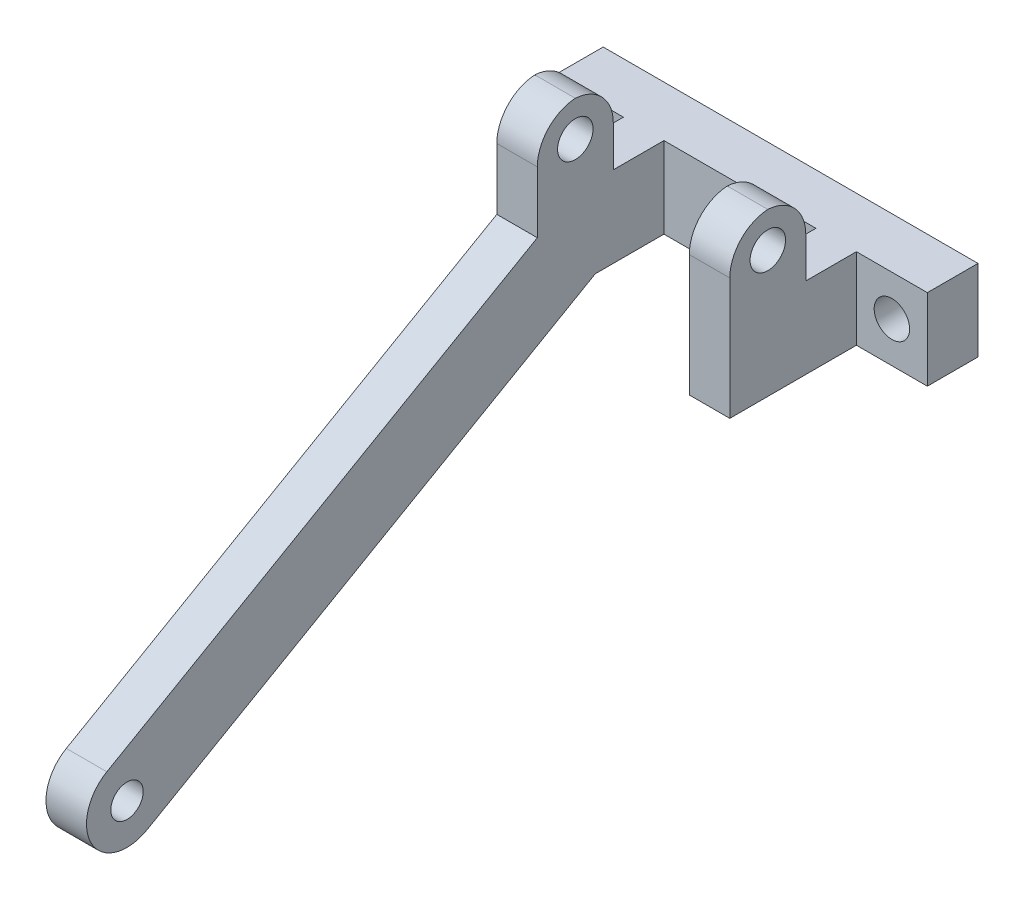
ISO-10303-21;
HEADER;
FILE_DESCRIPTION(('STEP AP214'),'2;1');
FILE_NAME('part.step','',(''),(''),'','','');
FILE_SCHEMA(('AUTOMOTIVE_DESIGN { 1 0 10303 214 1 1 1 1 }'));
ENDSEC;
DATA;
#1=APPLICATION_CONTEXT('core data for automotive mechanical design processes');
#2=APPLICATION_PROTOCOL_DEFINITION('international standard','automotive_design',2000,#1);
#3=PRODUCT_CONTEXT('',#1,'mechanical');
#4=PRODUCT('Part','Part','',(#3));
#5=PRODUCT_RELATED_PRODUCT_CATEGORY('part','',(#4));
#6=PRODUCT_DEFINITION_FORMATION('','',#4);
#7=PRODUCT_DEFINITION_CONTEXT('part definition',#1,'design');
#8=PRODUCT_DEFINITION('design','',#6,#7);
#9=PRODUCT_DEFINITION_SHAPE('','',#8);
#10=(LENGTH_UNIT() NAMED_UNIT(*) SI_UNIT(.MILLI.,.METRE.));
#11=(NAMED_UNIT(*) PLANE_ANGLE_UNIT() SI_UNIT($,.RADIAN.));
#12=(NAMED_UNIT(*) SI_UNIT($,.STERADIAN.) SOLID_ANGLE_UNIT());
#13=UNCERTAINTY_MEASURE_WITH_UNIT(LENGTH_MEASURE(1.E-05),#10,'distance_accuracy_value','');
#14=(GEOMETRIC_REPRESENTATION_CONTEXT(3) GLOBAL_UNCERTAINTY_ASSIGNED_CONTEXT((#13)) GLOBAL_UNIT_ASSIGNED_CONTEXT((#10,
#11,#12)) REPRESENTATION_CONTEXT('',''));
#15=CARTESIAN_POINT('',(0.,0.,0.));
#16=DIRECTION('',(0.,0.,1.));
#17=DIRECTION('',(1.,0.,0.));
#18=AXIS2_PLACEMENT_3D('',#15,#16,#17);
#19=CARTESIAN_POINT('',(-18.5,4.00000000000001,5.));
#20=DIRECTION('',(0.,-1.,0.));
#21=DIRECTION('',(1.,0.,0.));
#22=AXIS2_PLACEMENT_3D('',#19,#20,#21);
#23=PLANE('',#22);
#24=DIRECTION('',(-1.,0.,0.));
#25=VECTOR('',#24,1.);
#26=CARTESIAN_POINT('',(11.5,4.,9.99999999999999));
#27=LINE('',#26,#25);
#28=CARTESIAN_POINT('',(11.5,4.,9.99999999999999));
#29=VERTEX_POINT('',#28);
#30=CARTESIAN_POINT('',(7.50000000000001,4.,9.99999999999999));
#31=VERTEX_POINT('',#30);
#32=EDGE_CURVE('E239',#29,#31,#27,.T.);
#33=ORIENTED_EDGE('',*,*,#32,.F.);
#34=DIRECTION('',(0.,0.,-1.));
#35=VECTOR('',#34,1.);
#36=CARTESIAN_POINT('',(11.5,4.,17.5));
#37=LINE('',#36,#35);
#38=CARTESIAN_POINT('',(11.5,3.99999999999999,5.));
#39=VERTEX_POINT('',#38);
#40=EDGE_CURVE('E405',#29,#39,#37,.T.);
#41=ORIENTED_EDGE('',*,*,#40,.T.);
#42=DIRECTION('',(-1.,0.,0.));
#43=VECTOR('',#42,1.);
#44=CARTESIAN_POINT('',(-18.5,4.00000000000001,5.));
#45=LINE('',#44,#43);
#46=CARTESIAN_POINT('',(18.5,3.99999999999999,5.));
#47=VERTEX_POINT('',#46);
#48=EDGE_CURVE('E313',#47,#39,#45,.T.);
#49=ORIENTED_EDGE('',*,*,#48,.F.);
#50=DIRECTION('',(0.,0.,-1.));
#51=VECTOR('',#50,1.);
#52=CARTESIAN_POINT('',(18.5,3.99999999999999,5.));
#53=LINE('',#52,#51);
#54=CARTESIAN_POINT('',(18.5,3.99999999999999,0.));
#55=VERTEX_POINT('',#54);
#56=EDGE_CURVE('E269',#47,#55,#53,.T.);
#57=ORIENTED_EDGE('',*,*,#56,.T.);
#58=DIRECTION('',(-1.,0.,0.));
#59=VECTOR('',#58,1.);
#60=CARTESIAN_POINT('',(-18.5,4.00000000000001,0.));
#61=LINE('',#60,#59);
#62=CARTESIAN_POINT('',(-18.5,4.00000000000001,0.));
#63=VERTEX_POINT('',#62);
#64=EDGE_CURVE('E346',#55,#63,#61,.T.);
#65=ORIENTED_EDGE('',*,*,#64,.T.);
#66=DIRECTION('',(0.,0.,-1.));
#67=VECTOR('',#66,1.);
#68=CARTESIAN_POINT('',(-18.5,4.00000000000001,5.));
#69=LINE('',#68,#67);
#70=CARTESIAN_POINT('',(-18.5,4.00000000000001,5.));
#71=VERTEX_POINT('',#70);
#72=EDGE_CURVE('E332',#71,#63,#69,.T.);
#73=ORIENTED_EDGE('',*,*,#72,.F.);
#74=CARTESIAN_POINT('',(-11.5,4.,5.));
#75=VERTEX_POINT('',#74);
#76=EDGE_CURVE('E314',#75,#71,#45,.T.);
#77=ORIENTED_EDGE('',*,*,#76,.F.);
#78=DIRECTION('',(0.,0.,-1.));
#79=VECTOR('',#78,1.);
#80=CARTESIAN_POINT('',(-11.5,4.,17.5));
#81=LINE('',#80,#79);
#82=CARTESIAN_POINT('',(-11.5,4.,10.));
#83=VERTEX_POINT('',#82);
#84=EDGE_CURVE('E298',#83,#75,#81,.T.);
#85=ORIENTED_EDGE('',*,*,#84,.F.);
#86=DIRECTION('',(-1.,0.,0.));
#87=VECTOR('',#86,1.);
#88=CARTESIAN_POINT('',(-11.5,4.,10.));
#89=LINE('',#88,#87);
#90=CARTESIAN_POINT('',(-7.5,4.,10.));
#91=VERTEX_POINT('',#90);
#92=EDGE_CURVE('E246',#91,#83,#89,.T.);
#93=ORIENTED_EDGE('',*,*,#92,.F.);
#94=DIRECTION('',(0.,0.,-1.));
#95=VECTOR('',#94,1.);
#96=CARTESIAN_POINT('',(-7.5,4.,17.5));
#97=LINE('',#96,#95);
#98=CARTESIAN_POINT('',(-7.5,4.,5.));
#99=VERTEX_POINT('',#98);
#100=EDGE_CURVE('E256',#91,#99,#97,.T.);
#101=ORIENTED_EDGE('',*,*,#100,.T.);
#102=CARTESIAN_POINT('',(7.5,3.99999999999999,5.));
#103=VERTEX_POINT('',#102);
#104=EDGE_CURVE('E309',#103,#99,#45,.T.);
#105=ORIENTED_EDGE('',*,*,#104,.F.);
#106=DIRECTION('',(0.,0.,-1.));
#107=VECTOR('',#106,1.);
#108=CARTESIAN_POINT('',(7.5,4.,17.5));
#109=LINE('',#108,#107);
#110=EDGE_CURVE('E408',#31,#103,#109,.T.);
#111=ORIENTED_EDGE('',*,*,#110,.F.);
#112=EDGE_LOOP('',(#33,#41,#49,#57,#65,#73,#77,#85,#93,#101,#105,#111));
#113=FACE_BOUND('',#112,.T.);
#114=ADVANCED_FACE('F37',(#113),#23,.F.);
#115=CARTESIAN_POINT('',(0.,0.,5.));
#116=DIRECTION('',(0.,0.,1.));
#117=DIRECTION('',(1.,0.,0.));
#118=AXIS2_PLACEMENT_3D('',#115,#116,#117);
#119=PLANE('',#118);
#120=CARTESIAN_POINT('',(15.,0.,5.));
#121=DIRECTION('',(0.,0.,1.));
#122=DIRECTION('',(-1.,0.,0.));
#123=AXIS2_PLACEMENT_3D('',#120,#121,#122);
#124=CIRCLE('',#123,1.75);
#125=CARTESIAN_POINT('',(13.25,0.,5.));
#126=VERTEX_POINT('',#125);
#127=EDGE_CURVE('E350',#126,#126,#124,.T.);
#128=ORIENTED_EDGE('',*,*,#127,.F.);
#129=EDGE_LOOP('',(#128));
#130=FACE_BOUND('',#129,.T.);
#131=ORIENTED_EDGE('',*,*,#48,.T.);
#132=DIRECTION('',(0.,1.,0.));
#133=VECTOR('',#132,1.);
#134=CARTESIAN_POINT('',(11.5,4.,5.));
#135=LINE('',#134,#133);
#136=CARTESIAN_POINT('',(11.5,-4.,5.));
#137=VERTEX_POINT('',#136);
#138=EDGE_CURVE('E273',#137,#39,#135,.T.);
#139=ORIENTED_EDGE('',*,*,#138,.F.);
#140=DIRECTION('',(1.,0.,0.));
#141=VECTOR('',#140,1.);
#142=CARTESIAN_POINT('',(-18.5,-4.00000000000001,5.));
#143=LINE('',#142,#141);
#144=CARTESIAN_POINT('',(18.5,-4.00000000000001,5.));
#145=VERTEX_POINT('',#144);
#146=EDGE_CURVE('E315',#137,#145,#143,.T.);
#147=ORIENTED_EDGE('',*,*,#146,.T.);
#148=DIRECTION('',(0.,1.,0.));
#149=VECTOR('',#148,1.);
#150=CARTESIAN_POINT('',(18.5,3.99999999999999,5.));
#151=LINE('',#150,#149);
#152=EDGE_CURVE('E320',#145,#47,#151,.T.);
#153=ORIENTED_EDGE('',*,*,#152,.T.);
#154=EDGE_LOOP('',(#131,#139,#147,#153));
#155=FACE_BOUND('',#154,.T.);
#156=ADVANCED_FACE('F446',(#130,#155),#119,.T.);
#157=CARTESIAN_POINT('',(-7.5,-4.00000000000001,5.));
#158=VERTEX_POINT('',#157);
#159=CARTESIAN_POINT('',(7.5,-4.00000000000001,5.));
#160=VERTEX_POINT('',#159);
#161=EDGE_CURVE('E354',#158,#160,#143,.T.);
#162=ORIENTED_EDGE('',*,*,#161,.T.);
#163=DIRECTION('',(0.,-1.,0.));
#164=VECTOR('',#163,1.);
#165=CARTESIAN_POINT('',(7.5,4.,5.));
#166=LINE('',#165,#164);
#167=EDGE_CURVE('E421',#103,#160,#166,.T.);
#168=ORIENTED_EDGE('',*,*,#167,.F.);
#169=ORIENTED_EDGE('',*,*,#104,.T.);
#170=DIRECTION('',(0.,1.,0.));
#171=VECTOR('',#170,1.);
#172=CARTESIAN_POINT('',(-7.5,4.,5.));
#173=LINE('',#172,#171);
#174=EDGE_CURVE('E403',#158,#99,#173,.T.);
#175=ORIENTED_EDGE('',*,*,#174,.F.);
#176=EDGE_LOOP('',(#162,#168,#169,#175));
#177=FACE_BOUND('',#176,.T.);
#178=ADVANCED_FACE('F476',(#177),#119,.T.);
#179=DIRECTION('',(0.,-1.,0.));
#180=VECTOR('',#179,1.);
#181=CARTESIAN_POINT('',(-11.5,4.,5.));
#182=LINE('',#181,#180);
#183=CARTESIAN_POINT('',(-11.5,-4.,5.));
#184=VERTEX_POINT('',#183);
#185=EDGE_CURVE('E302',#75,#184,#182,.T.);
#186=ORIENTED_EDGE('',*,*,#185,.F.);
#187=ORIENTED_EDGE('',*,*,#76,.T.);
#188=DIRECTION('',(0.,-1.,0.));
#189=VECTOR('',#188,1.);
#190=CARTESIAN_POINT('',(-18.5,4.00000000000001,5.));
#191=LINE('',#190,#189);
#192=CARTESIAN_POINT('',(-18.5,-4.00000000000001,5.));
#193=VERTEX_POINT('',#192);
#194=EDGE_CURVE('E322',#71,#193,#191,.T.);
#195=ORIENTED_EDGE('',*,*,#194,.T.);
#196=EDGE_CURVE('E341',#193,#184,#143,.T.);
#197=ORIENTED_EDGE('',*,*,#196,.T.);
#198=EDGE_LOOP('',(#186,#187,#195,#197));
#199=FACE_BOUND('',#198,.T.);
#200=CARTESIAN_POINT('',(-15.,0.,5.));
#201=DIRECTION('',(0.,0.,1.));
#202=DIRECTION('',(1.,0.,0.));
#203=AXIS2_PLACEMENT_3D('',#200,#201,#202);
#204=CIRCLE('',#203,1.75);
#205=CARTESIAN_POINT('',(-13.25,0.,5.));
#206=VERTEX_POINT('',#205);
#207=EDGE_CURVE('E465',#206,#206,#204,.T.);
#208=ORIENTED_EDGE('',*,*,#207,.F.);
#209=EDGE_LOOP('',(#208));
#210=FACE_BOUND('',#209,.T.);
#211=ADVANCED_FACE('F370',(#199,#210),#119,.T.);
#212=CARTESIAN_POINT('',(0.,0.,0.));
#213=DIRECTION('',(0.,0.,1.));
#214=DIRECTION('',(1.,0.,0.));
#215=AXIS2_PLACEMENT_3D('',#212,#213,#214);
#216=PLANE('',#215);
#217=DIRECTION('',(0.,1.,0.));
#218=VECTOR('',#217,1.);
#219=CARTESIAN_POINT('',(18.5,3.99999999999999,0.));
#220=LINE('',#219,#218);
#221=CARTESIAN_POINT('',(18.5,-4.00000000000001,0.));
#222=VERTEX_POINT('',#221);
#223=EDGE_CURVE('E348',#222,#55,#220,.T.);
#224=ORIENTED_EDGE('',*,*,#223,.F.);
#225=DIRECTION('',(1.,0.,0.));
#226=VECTOR('',#225,1.);
#227=CARTESIAN_POINT('',(-18.5,-4.00000000000001,0.));
#228=LINE('',#227,#226);
#229=CARTESIAN_POINT('',(-18.5,-4.00000000000001,0.));
#230=VERTEX_POINT('',#229);
#231=EDGE_CURVE('E342',#230,#222,#228,.T.);
#232=ORIENTED_EDGE('',*,*,#231,.F.);
#233=DIRECTION('',(0.,-1.,0.));
#234=VECTOR('',#233,1.);
#235=CARTESIAN_POINT('',(-18.5,4.00000000000001,0.));
#236=LINE('',#235,#234);
#237=EDGE_CURVE('E344',#63,#230,#236,.T.);
#238=ORIENTED_EDGE('',*,*,#237,.F.);
#239=ORIENTED_EDGE('',*,*,#64,.F.);
#240=EDGE_LOOP('',(#224,#232,#238,#239));
#241=FACE_BOUND('',#240,.T.);
#242=CARTESIAN_POINT('',(15.,0.,0.));
#243=DIRECTION('',(0.,0.,1.));
#244=DIRECTION('',(-1.,0.,0.));
#245=AXIS2_PLACEMENT_3D('',#242,#243,#244);
#246=CIRCLE('',#245,1.75);
#247=CARTESIAN_POINT('',(13.25,0.,0.));
#248=VERTEX_POINT('',#247);
#249=EDGE_CURVE('E460',#248,#248,#246,.T.);
#250=ORIENTED_EDGE('',*,*,#249,.T.);
#251=EDGE_LOOP('',(#250));
#252=FACE_BOUND('',#251,.T.);
#253=CARTESIAN_POINT('',(-15.,0.,0.));
#254=DIRECTION('',(0.,0.,1.));
#255=DIRECTION('',(1.,0.,0.));
#256=AXIS2_PLACEMENT_3D('',#253,#254,#255);
#257=CIRCLE('',#256,1.75);
#258=CARTESIAN_POINT('',(-13.25,0.,0.));
#259=VERTEX_POINT('',#258);
#260=EDGE_CURVE('E463',#259,#259,#257,.T.);
#261=ORIENTED_EDGE('',*,*,#260,.T.);
#262=EDGE_LOOP('',(#261));
#263=FACE_BOUND('',#262,.T.);
#264=ADVANCED_FACE('F453',(#241,#252,#263),#216,.F.);
#265=CARTESIAN_POINT('',(18.5,3.99999999999999,5.));
#266=DIRECTION('',(-1.,0.,0.));
#267=DIRECTION('',(0.,-1.,0.));
#268=AXIS2_PLACEMENT_3D('',#265,#266,#267);
#269=PLANE('',#268);
#270=ORIENTED_EDGE('',*,*,#223,.T.);
#271=ORIENTED_EDGE('',*,*,#56,.F.);
#272=ORIENTED_EDGE('',*,*,#152,.F.);
#273=DIRECTION('',(0.,0.,-1.));
#274=VECTOR('',#273,1.);
#275=CARTESIAN_POINT('',(18.5,-4.00000000000001,5.));
#276=LINE('',#275,#274);
#277=EDGE_CURVE('E338',#145,#222,#276,.T.);
#278=ORIENTED_EDGE('',*,*,#277,.T.);
#279=EDGE_LOOP('',(#270,#271,#272,#278));
#280=FACE_BOUND('',#279,.T.);
#281=ADVANCED_FACE('F451',(#280),#269,.F.);
#282=CARTESIAN_POINT('',(-18.5,4.00000000000001,5.));
#283=DIRECTION('',(1.,0.,0.));
#284=DIRECTION('',(0.,1.,0.));
#285=AXIS2_PLACEMENT_3D('',#282,#283,#284);
#286=PLANE('',#285);
#287=ORIENTED_EDGE('',*,*,#237,.T.);
#288=DIRECTION('',(0.,0.,-1.));
#289=VECTOR('',#288,1.);
#290=CARTESIAN_POINT('',(-18.5,-4.00000000000001,5.));
#291=LINE('',#290,#289);
#292=EDGE_CURVE('E335',#193,#230,#291,.T.);
#293=ORIENTED_EDGE('',*,*,#292,.F.);
#294=ORIENTED_EDGE('',*,*,#194,.F.);
#295=ORIENTED_EDGE('',*,*,#72,.T.);
#296=EDGE_LOOP('',(#287,#293,#294,#295));
#297=FACE_BOUND('',#296,.T.);
#298=ADVANCED_FACE('F375',(#297),#286,.F.);
#299=CARTESIAN_POINT('',(-18.5,-4.00000000000001,5.));
#300=DIRECTION('',(0.,1.,0.));
#301=DIRECTION('',(0.,0.,1.));
#302=AXIS2_PLACEMENT_3D('',#299,#300,#301);
#303=PLANE('',#302);
#304=DIRECTION('',(0.,0.,-1.));
#305=VECTOR('',#304,1.);
#306=CARTESIAN_POINT('',(-7.5,-4.,17.5));
#307=LINE('',#306,#305);
#308=CARTESIAN_POINT('',(-7.5,-4.,11.7824011968437));
#309=VERTEX_POINT('',#308);
#310=EDGE_CURVE('E41',#309,#158,#307,.T.);
#311=ORIENTED_EDGE('',*,*,#310,.F.);
#312=DIRECTION('',(-1.,0.,0.));
#313=VECTOR('',#312,1.);
#314=CARTESIAN_POINT('',(51.9820828305763,-3.99999999999999,11.7824011968437));
#315=LINE('',#314,#313);
#316=CARTESIAN_POINT('',(-11.5,-4.,11.7824011968437));
#317=VERTEX_POINT('',#316);
#318=EDGE_CURVE('E59',#309,#317,#315,.T.);
#319=ORIENTED_EDGE('',*,*,#318,.T.);
#320=DIRECTION('',(0.,0.,-1.));
#321=VECTOR('',#320,1.);
#322=CARTESIAN_POINT('',(-11.5,-4.,17.5));
#323=LINE('',#322,#321);
#324=EDGE_CURVE('E296',#317,#184,#323,.T.);
#325=ORIENTED_EDGE('',*,*,#324,.T.);
#326=ORIENTED_EDGE('',*,*,#196,.F.);
#327=ORIENTED_EDGE('',*,*,#292,.T.);
#328=ORIENTED_EDGE('',*,*,#231,.T.);
#329=ORIENTED_EDGE('',*,*,#277,.F.);
#330=ORIENTED_EDGE('',*,*,#146,.F.);
#331=DIRECTION('',(0.,0.,-1.));
#332=VECTOR('',#331,1.);
#333=CARTESIAN_POINT('',(11.5,-4.,17.5));
#334=LINE('',#333,#332);
#335=CARTESIAN_POINT('',(11.5,-4.,17.5));
#336=VERTEX_POINT('',#335);
#337=EDGE_CURVE('E417',#336,#137,#334,.T.);
#338=ORIENTED_EDGE('',*,*,#337,.F.);
#339=DIRECTION('',(1.,0.,0.));
#340=VECTOR('',#339,1.);
#341=CARTESIAN_POINT('',(11.5,-4.,17.5));
#342=LINE('',#341,#340);
#343=CARTESIAN_POINT('',(7.5,-4.,17.5));
#344=VERTEX_POINT('',#343);
#345=EDGE_CURVE('E420',#344,#336,#342,.T.);
#346=ORIENTED_EDGE('',*,*,#345,.F.);
#347=DIRECTION('',(0.,0.,-1.));
#348=VECTOR('',#347,1.);
#349=CARTESIAN_POINT('',(7.5,-4.,17.5));
#350=LINE('',#349,#348);
#351=EDGE_CURVE('E412',#344,#160,#350,.T.);
#352=ORIENTED_EDGE('',*,*,#351,.T.);
#353=ORIENTED_EDGE('',*,*,#161,.F.);
#354=EDGE_LOOP('',(#311,#319,#325,#326,#327,#328,#329,#330,#338,#346,#352,#353));
#355=FACE_BOUND('',#354,.T.);
#356=ADVANCED_FACE('F378',(#355),#303,.F.);
#357=CARTESIAN_POINT('',(15.,0.,5.));
#358=DIRECTION('',(0.,0.,-1.));
#359=DIRECTION('',(-1.,0.,0.));
#360=AXIS2_PLACEMENT_3D('',#357,#358,#359);
#361=CYLINDRICAL_SURFACE('',#360,1.75);
#362=ORIENTED_EDGE('',*,*,#127,.T.);
#363=EDGE_LOOP('',(#362));
#364=FACE_BOUND('',#363,.T.);
#365=ORIENTED_EDGE('',*,*,#249,.F.);
#366=EDGE_LOOP('',(#365));
#367=FACE_BOUND('',#366,.T.);
#368=ADVANCED_FACE('F472',(#364,#367),#361,.F.);
#369=CARTESIAN_POINT('',(-15.,0.,5.));
#370=DIRECTION('',(0.,0.,-1.));
#371=DIRECTION('',(-1.,0.,0.));
#372=AXIS2_PLACEMENT_3D('',#369,#370,#371);
#373=CYLINDRICAL_SURFACE('',#372,1.75);
#374=ORIENTED_EDGE('',*,*,#207,.T.);
#375=EDGE_LOOP('',(#374));
#376=FACE_BOUND('',#375,.T.);
#377=ORIENTED_EDGE('',*,*,#260,.F.);
#378=EDGE_LOOP('',(#377));
#379=FACE_BOUND('',#378,.T.);
#380=ADVANCED_FACE('F520',(#376,#379),#373,.F.);
#381=CARTESIAN_POINT('',(-7.5,4.,17.5));
#382=DIRECTION('',(-1.,0.,0.));
#383=DIRECTION('',(0.,-1.,0.));
#384=AXIS2_PLACEMENT_3D('',#381,#382,#383);
#385=PLANE('',#384);
#386=DIRECTION('',(0.,0.498023695386812,-0.867163421065063));
#387=VECTOR('',#386,1.);
#388=CARTESIAN_POINT('',(-7.49999999999999,-29.4012275165706,56.011251262729));
#389=LINE('',#388,#387);
#390=CARTESIAN_POINT('',(-7.49999999999999,-29.4012275165706,56.011251262729));
#391=VERTEX_POINT('',#390);
#392=EDGE_CURVE('E219',#391,#309,#389,.T.);
#393=ORIENTED_EDGE('',*,*,#392,.T.);
#394=ORIENTED_EDGE('',*,*,#310,.T.);
#395=ORIENTED_EDGE('',*,*,#174,.T.);
#396=ORIENTED_EDGE('',*,*,#100,.F.);
#397=DIRECTION('',(0.,-1.,0.));
#398=VECTOR('',#397,1.);
#399=CARTESIAN_POINT('',(-7.5,12.,10.));
#400=LINE('',#399,#398);
#401=CARTESIAN_POINT('',(-7.5,8.,10.));
#402=VERTEX_POINT('',#401);
#403=EDGE_CURVE('E265',#402,#91,#400,.T.);
#404=ORIENTED_EDGE('',*,*,#403,.F.);
#405=CARTESIAN_POINT('',(-7.5,8.,14.));
#406=DIRECTION('',(-1.,0.,0.));
#407=DIRECTION('',(0.,-1.,0.));
#408=AXIS2_PLACEMENT_3D('',#405,#406,#407);
#409=CIRCLE('',#408,4.);
#410=CARTESIAN_POINT('',(-7.5,11.9921798556678,13.75));
#411=VERTEX_POINT('',#410);
#412=EDGE_CURVE('E279',#402,#411,#409,.F.);
#413=ORIENTED_EDGE('',*,*,#412,.T.);
#414=CARTESIAN_POINT('',(-7.5,8.,13.5));
#415=DIRECTION('',(-1.,0.,0.));
#416=DIRECTION('',(0.,-1.,0.));
#417=AXIS2_PLACEMENT_3D('',#414,#415,#416);
#418=CIRCLE('',#417,4.);
#419=CARTESIAN_POINT('',(-7.5,8.,17.5));
#420=VERTEX_POINT('',#419);
#421=EDGE_CURVE('E276',#411,#420,#418,.F.);
#422=ORIENTED_EDGE('',*,*,#421,.T.);
#423=DIRECTION('',(0.,1.,0.));
#424=VECTOR('',#423,1.);
#425=CARTESIAN_POINT('',(-7.5,4.,17.5));
#426=LINE('',#425,#424);
#427=CARTESIAN_POINT('',(-7.5,1.94178696904042,17.5));
#428=VERTEX_POINT('',#427);
#429=EDGE_CURVE('E389',#428,#420,#426,.T.);
#430=ORIENTED_EDGE('',*,*,#429,.F.);
#431=DIRECTION('',(0.,-0.498023695386812,0.867163421065063));
#432=VECTOR('',#431,1.);
#433=CARTESIAN_POINT('',(-7.5,1.94178696904042,17.5));
#434=LINE('',#433,#432);
#435=CARTESIAN_POINT('',(-7.5,-22.4639201480501,59.9954408258235));
#436=VERTEX_POINT('',#435);
#437=EDGE_CURVE('E227',#428,#436,#434,.T.);
#438=ORIENTED_EDGE('',*,*,#437,.T.);
#439=CARTESIAN_POINT('',(-7.5,-25.9325738323104,58.0033460442762));
#440=DIRECTION('',(-1.,0.,0.));
#441=DIRECTION('',(0.,-1.,0.));
#442=AXIS2_PLACEMENT_3D('',#439,#440,#441);
#443=CIRCLE('',#442,4.);
#444=EDGE_CURVE('E190',#436,#391,#443,.F.);
#445=ORIENTED_EDGE('',*,*,#444,.T.);
#446=EDGE_LOOP('',(#393,#394,#395,#396,#404,#413,#422,#430,#438,#445));
#447=FACE_BOUND('',#446,.T.);
#448=CARTESIAN_POINT('',(-7.5,8.5,13.75));
#449=DIRECTION('',(-1.,0.,0.));
#450=DIRECTION('',(0.,-1.,0.));
#451=AXIS2_PLACEMENT_3D('',#448,#449,#450);
#452=CIRCLE('',#451,1.75);
#453=CARTESIAN_POINT('',(-7.5,6.75,13.75));
#454=VERTEX_POINT('',#453);
#455=EDGE_CURVE('E236',#454,#454,#452,.T.);
#456=ORIENTED_EDGE('',*,*,#455,.T.);
#457=EDGE_LOOP('',(#456));
#458=FACE_BOUND('',#457,.T.);
#459=CARTESIAN_POINT('',(-7.5,-25.9325738323104,58.0033460442762));
#460=DIRECTION('',(-1.,0.,0.));
#461=DIRECTION('',(0.,-1.,0.));
#462=AXIS2_PLACEMENT_3D('',#459,#460,#461);
#463=CIRCLE('',#462,1.60000000000006);
#464=CARTESIAN_POINT('',(-7.5,-27.5325738323104,58.0033460442762));
#465=VERTEX_POINT('',#464);
#466=EDGE_CURVE('E222',#465,#465,#463,.F.);
#467=ORIENTED_EDGE('',*,*,#466,.F.);
#468=EDGE_LOOP('',(#467));
#469=FACE_BOUND('',#468,.T.);
#470=ADVANCED_FACE('F387',(#447,#458,#469),#385,.F.);
#471=CARTESIAN_POINT('',(-11.5,4.,17.5));
#472=DIRECTION('',(1.,0.,0.));
#473=DIRECTION('',(0.,1.,0.));
#474=AXIS2_PLACEMENT_3D('',#471,#472,#473);
#475=PLANE('',#474);
#476=ORIENTED_EDGE('',*,*,#324,.F.);
#477=DIRECTION('',(0.,-0.498023695386812,0.867163421065063));
#478=VECTOR('',#477,1.);
#479=CARTESIAN_POINT('',(-11.5,-29.4012275165706,56.011251262729));
#480=LINE('',#479,#478);
#481=CARTESIAN_POINT('',(-11.5,-29.4012275165706,56.011251262729));
#482=VERTEX_POINT('',#481);
#483=EDGE_CURVE('E194',#317,#482,#480,.T.);
#484=ORIENTED_EDGE('',*,*,#483,.T.);
#485=CARTESIAN_POINT('',(-11.5,-25.9325738323104,58.0033460442762));
#486=DIRECTION('',(-1.,0.,0.));
#487=DIRECTION('',(0.,-1.,0.));
#488=AXIS2_PLACEMENT_3D('',#485,#486,#487);
#489=CIRCLE('',#488,4.);
#490=CARTESIAN_POINT('',(-11.5,-22.4639201480501,59.9954408258235));
#491=VERTEX_POINT('',#490);
#492=EDGE_CURVE('E188',#482,#491,#489,.T.);
#493=ORIENTED_EDGE('',*,*,#492,.T.);
#494=DIRECTION('',(0.,0.498023695386812,-0.867163421065063));
#495=VECTOR('',#494,1.);
#496=CARTESIAN_POINT('',(-11.5,1.94178696904042,17.5));
#497=LINE('',#496,#495);
#498=CARTESIAN_POINT('',(-11.5,1.94178696904042,17.5));
#499=VERTEX_POINT('',#498);
#500=EDGE_CURVE('E198',#491,#499,#497,.T.);
#501=ORIENTED_EDGE('',*,*,#500,.T.);
#502=DIRECTION('',(0.,-1.,0.));
#503=VECTOR('',#502,1.);
#504=CARTESIAN_POINT('',(-11.5,4.,17.5));
#505=LINE('',#504,#503);
#506=CARTESIAN_POINT('',(-11.5,8.,17.5));
#507=VERTEX_POINT('',#506);
#508=EDGE_CURVE('E393',#507,#499,#505,.T.);
#509=ORIENTED_EDGE('',*,*,#508,.F.);
#510=CARTESIAN_POINT('',(-11.5,8.,13.5));
#511=DIRECTION('',(1.,0.,0.));
#512=DIRECTION('',(0.,1.,0.));
#513=AXIS2_PLACEMENT_3D('',#510,#511,#512);
#514=CIRCLE('',#513,4.);
#515=CARTESIAN_POINT('',(-11.5,11.9921798556678,13.75));
#516=VERTEX_POINT('',#515);
#517=EDGE_CURVE('E266',#507,#516,#514,.F.);
#518=ORIENTED_EDGE('',*,*,#517,.T.);
#519=CARTESIAN_POINT('',(-11.5,8.,14.));
#520=DIRECTION('',(1.,0.,0.));
#521=DIRECTION('',(0.,1.,0.));
#522=AXIS2_PLACEMENT_3D('',#519,#520,#521);
#523=CIRCLE('',#522,4.);
#524=CARTESIAN_POINT('',(-11.5,8.,10.));
#525=VERTEX_POINT('',#524);
#526=EDGE_CURVE('E268',#516,#525,#523,.F.);
#527=ORIENTED_EDGE('',*,*,#526,.T.);
#528=DIRECTION('',(0.,-1.,0.));
#529=VECTOR('',#528,1.);
#530=CARTESIAN_POINT('',(-11.5,12.,10.));
#531=LINE('',#530,#529);
#532=EDGE_CURVE('E255',#525,#83,#531,.T.);
#533=ORIENTED_EDGE('',*,*,#532,.T.);
#534=ORIENTED_EDGE('',*,*,#84,.T.);
#535=ORIENTED_EDGE('',*,*,#185,.T.);
#536=EDGE_LOOP('',(#476,#484,#493,#501,#509,#518,#527,#533,#534,#535));
#537=FACE_BOUND('',#536,.T.);
#538=CARTESIAN_POINT('',(-11.5,8.5,13.75));
#539=DIRECTION('',(-1.,0.,0.));
#540=DIRECTION('',(0.,-1.,0.));
#541=AXIS2_PLACEMENT_3D('',#538,#539,#540);
#542=CIRCLE('',#541,1.75);
#543=CARTESIAN_POINT('',(-11.5,6.75,13.75));
#544=VERTEX_POINT('',#543);
#545=EDGE_CURVE('E228',#544,#544,#542,.T.);
#546=ORIENTED_EDGE('',*,*,#545,.F.);
#547=EDGE_LOOP('',(#546));
#548=FACE_BOUND('',#547,.T.);
#549=CARTESIAN_POINT('',(-11.5,-25.9325738323104,58.0033460442762));
#550=DIRECTION('',(-1.,0.,0.));
#551=DIRECTION('',(0.,-1.,0.));
#552=AXIS2_PLACEMENT_3D('',#549,#550,#551);
#553=CIRCLE('',#552,1.60000000000006);
#554=CARTESIAN_POINT('',(-11.5,-27.5325738323104,58.0033460442762));
#555=VERTEX_POINT('',#554);
#556=EDGE_CURVE('E208',#555,#555,#553,.T.);
#557=ORIENTED_EDGE('',*,*,#556,.F.);
#558=EDGE_LOOP('',(#557));
#559=FACE_BOUND('',#558,.T.);
#560=ADVANCED_FACE('F204',(#537,#548,#559),#475,.F.);
#561=CARTESIAN_POINT('',(0.,0.,17.5));
#562=DIRECTION('',(0.,0.,1.));
#563=DIRECTION('',(1.,0.,0.));
#564=AXIS2_PLACEMENT_3D('',#561,#562,#563);
#565=PLANE('',#564);
#566=DIRECTION('',(-1.,0.,0.));
#567=VECTOR('',#566,1.);
#568=CARTESIAN_POINT('',(51.9820828305763,1.94178696904043,17.5));
#569=LINE('',#568,#567);
#570=EDGE_CURVE('E193',#428,#499,#569,.T.);
#571=ORIENTED_EDGE('',*,*,#570,.F.);
#572=ORIENTED_EDGE('',*,*,#429,.T.);
#573=DIRECTION('',(1.,0.,0.));
#574=VECTOR('',#573,1.);
#575=CARTESIAN_POINT('',(-11.5,8.,17.5));
#576=LINE('',#575,#574);
#577=EDGE_CURVE('E11',#420,#507,#576,.F.);
#578=ORIENTED_EDGE('',*,*,#577,.T.);
#579=ORIENTED_EDGE('',*,*,#508,.T.);
#580=EDGE_LOOP('',(#571,#572,#578,#579));
#581=FACE_BOUND('',#580,.T.);
#582=ADVANCED_FACE('F395',(#581),#565,.T.);
#583=CARTESIAN_POINT('',(11.5,4.,17.5));
#584=DIRECTION('',(-1.,0.,0.));
#585=DIRECTION('',(0.,-1.,0.));
#586=AXIS2_PLACEMENT_3D('',#583,#584,#585);
#587=PLANE('',#586);
#588=CARTESIAN_POINT('',(11.5,8.5,13.75));
#589=DIRECTION('',(-1.,0.,0.));
#590=DIRECTION('',(0.,-1.,0.));
#591=AXIS2_PLACEMENT_3D('',#588,#589,#590);
#592=CIRCLE('',#591,1.75);
#593=CARTESIAN_POINT('',(11.5,6.75,13.75));
#594=VERTEX_POINT('',#593);
#595=EDGE_CURVE('E233',#594,#594,#592,.T.);
#596=ORIENTED_EDGE('',*,*,#595,.T.);
#597=EDGE_LOOP('',(#596));
#598=FACE_BOUND('',#597,.T.);
#599=DIRECTION('',(0.,-1.,0.));
#600=VECTOR('',#599,1.);
#601=CARTESIAN_POINT('',(11.5,12.,9.99999999999999));
#602=LINE('',#601,#600);
#603=CARTESIAN_POINT('',(11.5,8.,9.99999999999999));
#604=VERTEX_POINT('',#603);
#605=EDGE_CURVE('E244',#604,#29,#602,.T.);
#606=ORIENTED_EDGE('',*,*,#605,.F.);
#607=CARTESIAN_POINT('',(11.5,8.,14.));
#608=DIRECTION('',(-1.,0.,0.));
#609=DIRECTION('',(0.,-1.,0.));
#610=AXIS2_PLACEMENT_3D('',#607,#608,#609);
#611=CIRCLE('',#610,4.);
#612=CARTESIAN_POINT('',(11.5,11.9921798556678,13.75));
#613=VERTEX_POINT('',#612);
#614=EDGE_CURVE('E290',#604,#613,#611,.F.);
#615=ORIENTED_EDGE('',*,*,#614,.T.);
#616=CARTESIAN_POINT('',(11.5,8.,13.5));
#617=DIRECTION('',(-1.,0.,0.));
#618=DIRECTION('',(0.,-1.,0.));
#619=AXIS2_PLACEMENT_3D('',#616,#617,#618);
#620=CIRCLE('',#619,4.);
#621=CARTESIAN_POINT('',(11.5,8.,17.5));
#622=VERTEX_POINT('',#621);
#623=EDGE_CURVE('E288',#613,#622,#620,.F.);
#624=ORIENTED_EDGE('',*,*,#623,.T.);
#625=DIRECTION('',(0.,1.,0.));
#626=VECTOR('',#625,1.);
#627=CARTESIAN_POINT('',(11.5,4.,17.5));
#628=LINE('',#627,#626);
#629=EDGE_CURVE('E249',#336,#622,#628,.T.);
#630=ORIENTED_EDGE('',*,*,#629,.F.);
#631=ORIENTED_EDGE('',*,*,#337,.T.);
#632=ORIENTED_EDGE('',*,*,#138,.T.);
#633=ORIENTED_EDGE('',*,*,#40,.F.);
#634=EDGE_LOOP('',(#606,#615,#624,#630,#631,#632,#633));
#635=FACE_BOUND('',#634,.T.);
#636=ADVANCED_FACE('F445',(#598,#635),#587,.F.);
#637=CARTESIAN_POINT('',(7.5,4.,17.5));
#638=DIRECTION('',(1.,0.,0.));
#639=DIRECTION('',(0.,1.,0.));
#640=AXIS2_PLACEMENT_3D('',#637,#638,#639);
#641=PLANE('',#640);
#642=CARTESIAN_POINT('',(7.5,8.5,13.75));
#643=DIRECTION('',(1.,0.,0.));
#644=DIRECTION('',(0.,1.,0.));
#645=AXIS2_PLACEMENT_3D('',#642,#643,#644);
#646=CIRCLE('',#645,1.75);
#647=CARTESIAN_POINT('',(7.5,6.75,13.75));
#648=VERTEX_POINT('',#647);
#649=EDGE_CURVE('E231',#648,#648,#646,.T.);
#650=ORIENTED_EDGE('',*,*,#649,.T.);
#651=EDGE_LOOP('',(#650));
#652=FACE_BOUND('',#651,.T.);
#653=CARTESIAN_POINT('',(7.5,8.,13.5));
#654=DIRECTION('',(1.,0.,0.));
#655=DIRECTION('',(0.,1.,0.));
#656=AXIS2_PLACEMENT_3D('',#653,#654,#655);
#657=CIRCLE('',#656,4.);
#658=CARTESIAN_POINT('',(7.5,8.,17.5));
#659=VERTEX_POINT('',#658);
#660=CARTESIAN_POINT('',(7.5,11.9921798556678,13.75));
#661=VERTEX_POINT('',#660);
#662=EDGE_CURVE('E281',#659,#661,#657,.F.);
#663=ORIENTED_EDGE('',*,*,#662,.T.);
#664=CARTESIAN_POINT('',(7.5,8.,14.));
#665=DIRECTION('',(1.,0.,0.));
#666=DIRECTION('',(0.,1.,0.));
#667=AXIS2_PLACEMENT_3D('',#664,#665,#666);
#668=CIRCLE('',#667,4.);
#669=CARTESIAN_POINT('',(7.50000000000001,8.,9.99999999999999));
#670=VERTEX_POINT('',#669);
#671=EDGE_CURVE('E283',#661,#670,#668,.F.);
#672=ORIENTED_EDGE('',*,*,#671,.T.);
#673=DIRECTION('',(0.,-1.,0.));
#674=VECTOR('',#673,1.);
#675=CARTESIAN_POINT('',(7.50000000000001,12.,9.99999999999999));
#676=LINE('',#675,#674);
#677=EDGE_CURVE('E242',#670,#31,#676,.T.);
#678=ORIENTED_EDGE('',*,*,#677,.T.);
#679=ORIENTED_EDGE('',*,*,#110,.T.);
#680=ORIENTED_EDGE('',*,*,#167,.T.);
#681=ORIENTED_EDGE('',*,*,#351,.F.);
#682=DIRECTION('',(0.,-1.,0.));
#683=VECTOR('',#682,1.);
#684=CARTESIAN_POINT('',(7.5,4.,17.5));
#685=LINE('',#684,#683);
#686=EDGE_CURVE('E425',#659,#344,#685,.T.);
#687=ORIENTED_EDGE('',*,*,#686,.F.);
#688=EDGE_LOOP('',(#663,#672,#678,#679,#680,#681,#687));
#689=FACE_BOUND('',#688,.T.);
#690=ADVANCED_FACE('F442',(#652,#689),#641,.F.);
#691=CARTESIAN_POINT('',(0.,0.,17.5));
#692=DIRECTION('',(0.,0.,-1.));
#693=DIRECTION('',(-1.,0.,0.));
#694=AXIS2_PLACEMENT_3D('',#691,#692,#693);
#695=PLANE('',#694);
#696=ORIENTED_EDGE('',*,*,#629,.T.);
#697=DIRECTION('',(1.,0.,0.));
#698=VECTOR('',#697,1.);
#699=CARTESIAN_POINT('',(0.,8.,17.5));
#700=LINE('',#699,#698);
#701=EDGE_CURVE('E47',#622,#659,#700,.F.);
#702=ORIENTED_EDGE('',*,*,#701,.T.);
#703=ORIENTED_EDGE('',*,*,#686,.T.);
#704=ORIENTED_EDGE('',*,*,#345,.T.);
#705=EDGE_LOOP('',(#696,#702,#703,#704));
#706=FACE_BOUND('',#705,.T.);
#707=ADVANCED_FACE('F432',(#706),#695,.F.);
#708=CARTESIAN_POINT('',(-11.5,12.,10.));
#709=DIRECTION('',(0.,0.,1.));
#710=DIRECTION('',(1.,0.,0.));
#711=AXIS2_PLACEMENT_3D('',#708,#709,#710);
#712=PLANE('',#711);
#713=ORIENTED_EDGE('',*,*,#532,.F.);
#714=DIRECTION('',(-1.,0.,0.));
#715=VECTOR('',#714,1.);
#716=CARTESIAN_POINT('',(-11.5,8.,10.));
#717=LINE('',#716,#715);
#718=EDGE_CURVE('E271',#525,#402,#717,.F.);
#719=ORIENTED_EDGE('',*,*,#718,.T.);
#720=ORIENTED_EDGE('',*,*,#403,.T.);
#721=ORIENTED_EDGE('',*,*,#92,.T.);
#722=EDGE_LOOP('',(#713,#719,#720,#721));
#723=FACE_BOUND('',#722,.T.);
#724=ADVANCED_FACE('F566',(#723),#712,.F.);
#725=CARTESIAN_POINT('',(11.5,12.,9.99999999999999));
#726=DIRECTION('',(0.,0.,1.));
#727=DIRECTION('',(1.,0.,0.));
#728=AXIS2_PLACEMENT_3D('',#725,#726,#727);
#729=PLANE('',#728);
#730=ORIENTED_EDGE('',*,*,#677,.F.);
#731=DIRECTION('',(-1.,0.,0.));
#732=VECTOR('',#731,1.);
#733=CARTESIAN_POINT('',(11.5,8.,9.99999999999999));
#734=LINE('',#733,#732);
#735=EDGE_CURVE('E285',#670,#604,#734,.F.);
#736=ORIENTED_EDGE('',*,*,#735,.T.);
#737=ORIENTED_EDGE('',*,*,#605,.T.);
#738=ORIENTED_EDGE('',*,*,#32,.T.);
#739=EDGE_LOOP('',(#730,#736,#737,#738));
#740=FACE_BOUND('',#739,.T.);
#741=ADVANCED_FACE('F573',(#740),#729,.F.);
#742=CARTESIAN_POINT('',(18.5,8.50000000000001,13.75));
#743=DIRECTION('',(-1.,0.,0.));
#744=DIRECTION('',(0.,-1.,0.));
#745=AXIS2_PLACEMENT_3D('',#742,#743,#744);
#746=CYLINDRICAL_SURFACE('',#745,1.75);
#747=CARTESIAN_POINT('',(7.5,6.75,13.75));
#748=CARTESIAN_POINT('',(7.54166666666667,6.75,13.75));
#749=CARTESIAN_POINT('',(7.58333333333333,6.75,13.75));
#750=CARTESIAN_POINT('',(7.66666666666667,6.75,13.75));
#751=CARTESIAN_POINT('',(7.70833333333334,6.75,13.75));
#752=CARTESIAN_POINT('',(7.79166666666667,6.75,13.75));
#753=CARTESIAN_POINT('',(7.83333333333333,6.75,13.75));
#754=CARTESIAN_POINT('',(7.91666666666667,6.75,13.75));
#755=CARTESIAN_POINT('',(7.95833333333333,6.75,13.75));
#756=CARTESIAN_POINT('',(8.04166666666667,6.75,13.75));
#757=CARTESIAN_POINT('',(8.08333333333333,6.75,13.75));
#758=CARTESIAN_POINT('',(8.16666666666667,6.75,13.75));
#759=CARTESIAN_POINT('',(8.20833333333334,6.75,13.75));
#760=CARTESIAN_POINT('',(8.29166666666667,6.75,13.75));
#761=CARTESIAN_POINT('',(8.33333333333334,6.75,13.75));
#762=CARTESIAN_POINT('',(8.41666666666667,6.75,13.75));
#763=CARTESIAN_POINT('',(8.45833333333334,6.75,13.75));
#764=CARTESIAN_POINT('',(8.54166666666667,6.75,13.75));
#765=CARTESIAN_POINT('',(8.58333333333334,6.75,13.75));
#766=CARTESIAN_POINT('',(8.66666666666667,6.75,13.75));
#767=CARTESIAN_POINT('',(8.70833333333334,6.75,13.75));
#768=CARTESIAN_POINT('',(8.79166666666667,6.75,13.75));
#769=CARTESIAN_POINT('',(8.83333333333333,6.75,13.75));
#770=CARTESIAN_POINT('',(8.91666666666667,6.75,13.75));
#771=CARTESIAN_POINT('',(8.95833333333333,6.75,13.75));
#772=CARTESIAN_POINT('',(9.04166666666667,6.75,13.75));
#773=CARTESIAN_POINT('',(9.08333333333333,6.75,13.75));
#774=CARTESIAN_POINT('',(9.16666666666667,6.75,13.75));
#775=CARTESIAN_POINT('',(9.20833333333333,6.75,13.75));
#776=CARTESIAN_POINT('',(9.29166666666667,6.75,13.75));
#777=CARTESIAN_POINT('',(9.33333333333333,6.75,13.75));
#778=CARTESIAN_POINT('',(9.41666666666667,6.75,13.75));
#779=CARTESIAN_POINT('',(9.45833333333333,6.75,13.75));
#780=CARTESIAN_POINT('',(9.54166666666667,6.75,13.75));
#781=CARTESIAN_POINT('',(9.58333333333333,6.75,13.75));
#782=CARTESIAN_POINT('',(9.66666666666667,6.75,13.75));
#783=CARTESIAN_POINT('',(9.70833333333333,6.75,13.75));
#784=CARTESIAN_POINT('',(9.79166666666667,6.75,13.75));
#785=CARTESIAN_POINT('',(9.83333333333333,6.75,13.75));
#786=CARTESIAN_POINT('',(9.91666666666667,6.75,13.75));
#787=CARTESIAN_POINT('',(9.95833333333333,6.75,13.75));
#788=CARTESIAN_POINT('',(10.0416666666667,6.75,13.75));
#789=CARTESIAN_POINT('',(10.0833333333333,6.75,13.75));
#790=CARTESIAN_POINT('',(10.1666666666667,6.75,13.75));
#791=CARTESIAN_POINT('',(10.2083333333333,6.75,13.75));
#792=CARTESIAN_POINT('',(10.2916666666667,6.75,13.75));
#793=CARTESIAN_POINT('',(10.3333333333333,6.75,13.75));
#794=CARTESIAN_POINT('',(10.4166666666667,6.75,13.75));
#795=CARTESIAN_POINT('',(10.4583333333333,6.75,13.75));
#796=CARTESIAN_POINT('',(10.5416666666667,6.75,13.75));
#797=CARTESIAN_POINT('',(10.5833333333333,6.75,13.75));
#798=CARTESIAN_POINT('',(10.6666666666667,6.75,13.75));
#799=CARTESIAN_POINT('',(10.7083333333333,6.75,13.75));
#800=CARTESIAN_POINT('',(10.7916666666667,6.75,13.75));
#801=CARTESIAN_POINT('',(10.8333333333333,6.75,13.75));
#802=CARTESIAN_POINT('',(10.9166666666667,6.75,13.75));
#803=CARTESIAN_POINT('',(10.9583333333333,6.75,13.75));
#804=CARTESIAN_POINT('',(11.0416666666667,6.75,13.75));
#805=CARTESIAN_POINT('',(11.0833333333333,6.75,13.75));
#806=CARTESIAN_POINT('',(11.1666666666667,6.75,13.75));
#807=CARTESIAN_POINT('',(11.2083333333333,6.75,13.75));
#808=CARTESIAN_POINT('',(11.2916666666667,6.75,13.75));
#809=CARTESIAN_POINT('',(11.3333333333333,6.75,13.75));
#810=CARTESIAN_POINT('',(11.4166666666667,6.75,13.75));
#811=CARTESIAN_POINT('',(11.4583333333333,6.75,13.75));
#812=CARTESIAN_POINT('',(11.5,6.75,13.75));
#813=B_SPLINE_CURVE_WITH_KNOTS('',3,(#747,#748,#749,#750,#751,#752,#753,#754,#755,#756,#757,
#758,#759,#760,#761,#762,#763,#764,#765,#766,#767,#768,#769,#770,#771,#772,#773,#774,#775,#776,
#777,#778,#779,#780,#781,#782,#783,#784,#785,#786,#787,#788,#789,#790,#791,#792,#793,#794,#795,
#796,#797,#798,#799,#800,#801,#802,#803,#804,#805,#806,#807,#808,#809,#810,#811,#812),
.UNSPECIFIED.,.F.,.F.,(4,2,2,2,2,2,2,2,2,2,2,2,2,2,2,2,2,2,2,2,2,2,2,2,2,2,2,2,2,2,2,2,4),(0.,
0.125,0.25,0.375,0.5,0.625000000000001,0.750000000000001,0.875000000000001,1.,1.125,1.25,1.375,
1.5,1.625,1.75,1.875,2.,2.125,2.25,2.375,2.5,2.625,2.75,2.875,3.,3.125,3.25,3.375,3.5,3.625,
3.75,3.875,4.),.UNSPECIFIED.);
#814=EDGE_CURVE('BSEAM581',#648,#594,#813,.T.);
#815=ORIENTED_EDGE('',*,*,#649,.F.);
#816=ORIENTED_EDGE('',*,*,#595,.F.);
#817=ORIENTED_EDGE('',*,*,#814,.T.);
#818=ORIENTED_EDGE('',*,*,#814,.F.);
#819=EDGE_LOOP('',(#815,#817,#816,#818));
#820=FACE_BOUND('',#819,.T.);
#821=ADVANCED_FACE('F581',(#820),#746,.F.);
#822=CARTESIAN_POINT('',(-11.5,6.75,13.75));
#823=CARTESIAN_POINT('',(-11.4583333333333,6.75,13.75));
#824=CARTESIAN_POINT('',(-11.4166666666667,6.75,13.75));
#825=CARTESIAN_POINT('',(-11.3333333333333,6.75,13.75));
#826=CARTESIAN_POINT('',(-11.2916666666667,6.75,13.75));
#827=CARTESIAN_POINT('',(-11.2083333333333,6.75,13.75));
#828=CARTESIAN_POINT('',(-11.1666666666667,6.75,13.75));
#829=CARTESIAN_POINT('',(-11.0833333333333,6.75,13.75));
#830=CARTESIAN_POINT('',(-11.0416666666667,6.75,13.75));
#831=CARTESIAN_POINT('',(-10.9583333333333,6.75,13.75));
#832=CARTESIAN_POINT('',(-10.9166666666667,6.75,13.75));
#833=CARTESIAN_POINT('',(-10.8333333333333,6.75,13.75));
#834=CARTESIAN_POINT('',(-10.7916666666667,6.75,13.75));
#835=CARTESIAN_POINT('',(-10.7083333333333,6.75,13.75));
#836=CARTESIAN_POINT('',(-10.6666666666667,6.75,13.75));
#837=CARTESIAN_POINT('',(-10.5833333333333,6.75,13.75));
#838=CARTESIAN_POINT('',(-10.5416666666667,6.75,13.75));
#839=CARTESIAN_POINT('',(-10.4583333333333,6.75,13.75));
#840=CARTESIAN_POINT('',(-10.4166666666667,6.75,13.75));
#841=CARTESIAN_POINT('',(-10.3333333333333,6.75,13.75));
#842=CARTESIAN_POINT('',(-10.2916666666667,6.75,13.75));
#843=CARTESIAN_POINT('',(-10.2083333333333,6.75,13.75));
#844=CARTESIAN_POINT('',(-10.1666666666667,6.75,13.75));
#845=CARTESIAN_POINT('',(-10.0833333333333,6.75,13.75));
#846=CARTESIAN_POINT('',(-10.0416666666667,6.75,13.75));
#847=CARTESIAN_POINT('',(-9.95833333333333,6.75,13.75));
#848=CARTESIAN_POINT('',(-9.91666666666667,6.75,13.75));
#849=CARTESIAN_POINT('',(-9.83333333333333,6.75,13.75));
#850=CARTESIAN_POINT('',(-9.79166666666667,6.75,13.75));
#851=CARTESIAN_POINT('',(-9.70833333333333,6.75,13.75));
#852=CARTESIAN_POINT('',(-9.66666666666667,6.75,13.75));
#853=CARTESIAN_POINT('',(-9.58333333333333,6.75,13.75));
#854=CARTESIAN_POINT('',(-9.54166666666667,6.75,13.75));
#855=CARTESIAN_POINT('',(-9.45833333333333,6.75,13.75));
#856=CARTESIAN_POINT('',(-9.41666666666667,6.75,13.75));
#857=CARTESIAN_POINT('',(-9.33333333333333,6.75,13.75));
#858=CARTESIAN_POINT('',(-9.29166666666666,6.75,13.75));
#859=CARTESIAN_POINT('',(-9.20833333333333,6.75,13.75));
#860=CARTESIAN_POINT('',(-9.16666666666666,6.75,13.75));
#861=CARTESIAN_POINT('',(-9.08333333333333,6.75,13.75));
#862=CARTESIAN_POINT('',(-9.04166666666666,6.75,13.75));
#863=CARTESIAN_POINT('',(-8.95833333333333,6.75,13.75));
#864=CARTESIAN_POINT('',(-8.91666666666666,6.75,13.75));
#865=CARTESIAN_POINT('',(-8.83333333333333,6.75,13.75));
#866=CARTESIAN_POINT('',(-8.79166666666666,6.75,13.75));
#867=CARTESIAN_POINT('',(-8.70833333333333,6.75,13.75));
#868=CARTESIAN_POINT('',(-8.66666666666666,6.75,13.75));
#869=CARTESIAN_POINT('',(-8.58333333333333,6.75,13.75));
#870=CARTESIAN_POINT('',(-8.54166666666666,6.75,13.75));
#871=CARTESIAN_POINT('',(-8.45833333333333,6.75,13.75));
#872=CARTESIAN_POINT('',(-8.41666666666666,6.75,13.75));
#873=CARTESIAN_POINT('',(-8.33333333333333,6.75,13.75));
#874=CARTESIAN_POINT('',(-8.29166666666666,6.75,13.75));
#875=CARTESIAN_POINT('',(-8.20833333333333,6.75,13.75));
#876=CARTESIAN_POINT('',(-8.16666666666666,6.75,13.75));
#877=CARTESIAN_POINT('',(-8.08333333333333,6.75,13.75));
#878=CARTESIAN_POINT('',(-8.04166666666666,6.75,13.75));
#879=CARTESIAN_POINT('',(-7.95833333333333,6.75,13.75));
#880=CARTESIAN_POINT('',(-7.91666666666666,6.75,13.75));
#881=CARTESIAN_POINT('',(-7.83333333333333,6.75,13.75));
#882=CARTESIAN_POINT('',(-7.79166666666666,6.75,13.75));
#883=CARTESIAN_POINT('',(-7.70833333333333,6.75,13.75));
#884=CARTESIAN_POINT('',(-7.66666666666666,6.75,13.75));
#885=CARTESIAN_POINT('',(-7.58333333333333,6.75,13.75));
#886=CARTESIAN_POINT('',(-7.54166666666666,6.75,13.75));
#887=CARTESIAN_POINT('',(-7.5,6.75,13.75));
#888=B_SPLINE_CURVE_WITH_KNOTS('',3,(#822,#823,#824,#825,#826,#827,#828,#829,#830,#831,#832,
#833,#834,#835,#836,#837,#838,#839,#840,#841,#842,#843,#844,#845,#846,#847,#848,#849,#850,#851,
#852,#853,#854,#855,#856,#857,#858,#859,#860,#861,#862,#863,#864,#865,#866,#867,#868,#869,#870,
#871,#872,#873,#874,#875,#876,#877,#878,#879,#880,#881,#882,#883,#884,#885,#886,#887),
.UNSPECIFIED.,.F.,.F.,(4,2,2,2,2,2,2,2,2,2,2,2,2,2,2,2,2,2,2,2,2,2,2,2,2,2,2,2,2,2,2,2,4),(0.,
0.125,0.25,0.375,0.5,0.625000000000001,0.750000000000001,0.875000000000001,1.,1.125,1.25,1.375,
1.5,1.625,1.75,1.875,2.,2.125,2.25,2.375,2.5,2.625,2.75,2.875,3.,3.125,3.25,3.375,3.5,3.625,
3.75,3.875,4.),.UNSPECIFIED.);
#889=EDGE_CURVE('BSEAM590',#544,#454,#888,.T.);
#890=ORIENTED_EDGE('',*,*,#545,.T.);
#891=ORIENTED_EDGE('',*,*,#455,.F.);
#892=ORIENTED_EDGE('',*,*,#889,.T.);
#893=ORIENTED_EDGE('',*,*,#889,.F.);
#894=EDGE_LOOP('',(#890,#892,#891,#893));
#895=FACE_BOUND('',#894,.T.);
#896=ADVANCED_FACE('F590',(#895),#746,.F.);
#897=CARTESIAN_POINT('',(0.,8.,13.5));
#898=DIRECTION('',(-1.,0.,0.));
#899=DIRECTION('',(0.,0.,1.));
#900=AXIS2_PLACEMENT_3D('',#897,#898,#899);
#901=CYLINDRICAL_SURFACE('',#900,4.);
#902=ORIENTED_EDGE('',*,*,#577,.F.);
#903=ORIENTED_EDGE('',*,*,#421,.F.);
#904=DIRECTION('',(-1.,0.,0.));
#905=VECTOR('',#904,1.);
#906=CARTESIAN_POINT('',(-9.5,11.9921798556678,13.75));
#907=LINE('',#906,#905);
#908=EDGE_CURVE('E232',#516,#411,#907,.F.);
#909=ORIENTED_EDGE('',*,*,#908,.F.);
#910=ORIENTED_EDGE('',*,*,#517,.F.);
#911=EDGE_LOOP('',(#902,#903,#909,#910));
#912=FACE_BOUND('',#911,.T.);
#913=ADVANCED_FACE('F597',(#912),#901,.T.);
#914=CARTESIAN_POINT('',(0.,8.,14.));
#915=DIRECTION('',(-1.,0.,0.));
#916=DIRECTION('',(0.,0.,1.));
#917=AXIS2_PLACEMENT_3D('',#914,#915,#916);
#918=CYLINDRICAL_SURFACE('',#917,4.);
#919=ORIENTED_EDGE('',*,*,#412,.F.);
#920=ORIENTED_EDGE('',*,*,#718,.F.);
#921=ORIENTED_EDGE('',*,*,#526,.F.);
#922=ORIENTED_EDGE('',*,*,#908,.T.);
#923=EDGE_LOOP('',(#919,#920,#921,#922));
#924=FACE_BOUND('',#923,.T.);
#925=ADVANCED_FACE('F603',(#924),#918,.T.);
#926=CARTESIAN_POINT('',(0.,8.,13.5));
#927=DIRECTION('',(1.,0.,0.));
#928=DIRECTION('',(0.,0.,-1.));
#929=AXIS2_PLACEMENT_3D('',#926,#927,#928);
#930=CYLINDRICAL_SURFACE('',#929,4.);
#931=ORIENTED_EDGE('',*,*,#701,.F.);
#932=ORIENTED_EDGE('',*,*,#623,.F.);
#933=DIRECTION('',(1.,0.,0.));
#934=VECTOR('',#933,1.);
#935=CARTESIAN_POINT('',(9.50000000000001,11.9921798556678,13.75));
#936=LINE('',#935,#934);
#937=EDGE_CURVE('E226',#661,#613,#936,.T.);
#938=ORIENTED_EDGE('',*,*,#937,.F.);
#939=ORIENTED_EDGE('',*,*,#662,.F.);
#940=EDGE_LOOP('',(#931,#932,#938,#939));
#941=FACE_BOUND('',#940,.T.);
#942=ADVANCED_FACE('F39',(#941),#930,.T.);
#943=CARTESIAN_POINT('',(0.,8.,14.));
#944=DIRECTION('',(-1.,0.,0.));
#945=DIRECTION('',(0.,0.,1.));
#946=AXIS2_PLACEMENT_3D('',#943,#944,#945);
#947=CYLINDRICAL_SURFACE('',#946,4.);
#948=ORIENTED_EDGE('',*,*,#614,.F.);
#949=ORIENTED_EDGE('',*,*,#735,.F.);
#950=ORIENTED_EDGE('',*,*,#671,.F.);
#951=ORIENTED_EDGE('',*,*,#937,.T.);
#952=EDGE_LOOP('',(#948,#949,#950,#951));
#953=FACE_BOUND('',#952,.T.);
#954=ADVANCED_FACE('F618',(#953),#947,.T.);
#955=CARTESIAN_POINT('',(51.9820828305763,1.94178696904043,17.5));
#956=DIRECTION('',(0.,0.867163421065063,0.498023695386812));
#957=DIRECTION('',(0.,-0.498023695386812,0.867163421065063));
#958=AXIS2_PLACEMENT_3D('',#955,#956,#957);
#959=PLANE('',#958);
#960=ORIENTED_EDGE('',*,*,#437,.F.);
#961=ORIENTED_EDGE('',*,*,#570,.T.);
#962=ORIENTED_EDGE('',*,*,#500,.F.);
#963=DIRECTION('',(-1.,0.,0.));
#964=VECTOR('',#963,1.);
#965=CARTESIAN_POINT('',(51.9820828305763,-22.4639201480501,59.9954408258235));
#966=LINE('',#965,#964);
#967=EDGE_CURVE('E183',#436,#491,#966,.T.);
#968=ORIENTED_EDGE('',*,*,#967,.F.);
#969=EDGE_LOOP('',(#960,#961,#962,#968));
#970=FACE_BOUND('',#969,.T.);
#971=ADVANCED_FACE('F199',(#970),#959,.T.);
#972=CARTESIAN_POINT('',(51.9820828305763,-29.4012275165706,56.011251262729));
#973=DIRECTION('',(0.,-0.867163421065063,-0.498023695386812));
#974=DIRECTION('',(0.,0.498023695386812,-0.867163421065063));
#975=AXIS2_PLACEMENT_3D('',#972,#973,#974);
#976=PLANE('',#975);
#977=ORIENTED_EDGE('',*,*,#392,.F.);
#978=DIRECTION('',(-1.,0.,0.));
#979=VECTOR('',#978,1.);
#980=CARTESIAN_POINT('',(51.9820828305763,-29.4012275165706,56.011251262729));
#981=LINE('',#980,#979);
#982=EDGE_CURVE('E216',#391,#482,#981,.T.);
#983=ORIENTED_EDGE('',*,*,#982,.T.);
#984=ORIENTED_EDGE('',*,*,#483,.F.);
#985=ORIENTED_EDGE('',*,*,#318,.F.);
#986=EDGE_LOOP('',(#977,#983,#984,#985));
#987=FACE_BOUND('',#986,.T.);
#988=ADVANCED_FACE('F381',(#987),#976,.T.);
#989=CARTESIAN_POINT('',(51.9820828305763,-25.9325738323104,58.0033460442762));
#990=DIRECTION('',(-1.,0.,0.));
#991=DIRECTION('',(0.,-1.,0.));
#992=AXIS2_PLACEMENT_3D('',#989,#990,#991);
#993=CYLINDRICAL_SURFACE('',#992,4.);
#994=ORIENTED_EDGE('',*,*,#444,.F.);
#995=ORIENTED_EDGE('',*,*,#967,.T.);
#996=ORIENTED_EDGE('',*,*,#492,.F.);
#997=ORIENTED_EDGE('',*,*,#982,.F.);
#998=EDGE_LOOP('',(#994,#995,#996,#997));
#999=FACE_BOUND('',#998,.T.);
#1000=ADVANCED_FACE('F185',(#999),#993,.T.);
#1001=CARTESIAN_POINT('',(51.9820828305763,-25.9325738323104,58.0033460442762));
#1002=DIRECTION('',(-1.,0.,0.));
#1003=DIRECTION('',(0.,-1.,0.));
#1004=AXIS2_PLACEMENT_3D('',#1001,#1002,#1003);
#1005=CYLINDRICAL_SURFACE('',#1004,1.60000000000006);
#1006=ORIENTED_EDGE('',*,*,#466,.T.);
#1007=EDGE_LOOP('',(#1006));
#1008=FACE_BOUND('',#1007,.T.);
#1009=ORIENTED_EDGE('',*,*,#556,.T.);
#1010=EDGE_LOOP('',(#1009));
#1011=FACE_BOUND('',#1010,.T.);
#1012=ADVANCED_FACE('F640',(#1008,#1011),#1005,.F.);
#1013=CLOSED_SHELL('',(#114,#156,#178,#211,#264,#281,#298,#356,#368,#380,#470,#560,#582,#636,
#690,#707,#724,#741,#821,#896,#913,#925,#942,#954,#971,#988,#1000,#1012));
#1014=MANIFOLD_SOLID_BREP('B2',#1013);
#1015=ADVANCED_BREP_SHAPE_REPRESENTATION('',(#18,#1014),#14);
#1016=SHAPE_DEFINITION_REPRESENTATION(#9,#1015);
ENDSEC;
END-ISO-10303-21;
